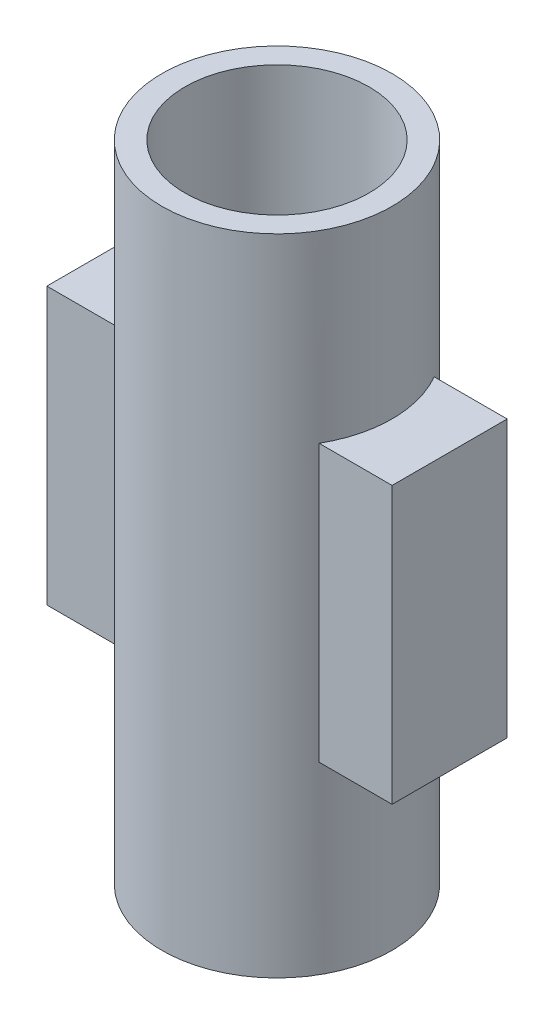
ISO-10303-21;
HEADER;
FILE_DESCRIPTION(('STEP AP214'),'2;1');
FILE_NAME('part.step','',(''),(''),'','','');
FILE_SCHEMA(('AUTOMOTIVE_DESIGN { 1 0 10303 214 1 1 1 1 }'));
ENDSEC;
DATA;
#1=APPLICATION_CONTEXT('core data for automotive mechanical design processes');
#2=APPLICATION_PROTOCOL_DEFINITION('international standard','automotive_design',2000,#1);
#3=PRODUCT_CONTEXT('',#1,'mechanical');
#4=PRODUCT('Part','Part','',(#3));
#5=PRODUCT_RELATED_PRODUCT_CATEGORY('part','',(#4));
#6=PRODUCT_DEFINITION_FORMATION('','',#4);
#7=PRODUCT_DEFINITION_CONTEXT('part definition',#1,'design');
#8=PRODUCT_DEFINITION('design','',#6,#7);
#9=PRODUCT_DEFINITION_SHAPE('','',#8);
#10=(LENGTH_UNIT() NAMED_UNIT(*) SI_UNIT(.MILLI.,.METRE.));
#11=(NAMED_UNIT(*) PLANE_ANGLE_UNIT() SI_UNIT($,.RADIAN.));
#12=(NAMED_UNIT(*) SI_UNIT($,.STERADIAN.) SOLID_ANGLE_UNIT());
#13=UNCERTAINTY_MEASURE_WITH_UNIT(LENGTH_MEASURE(1.E-05),#10,'distance_accuracy_value','');
#14=(GEOMETRIC_REPRESENTATION_CONTEXT(3) GLOBAL_UNCERTAINTY_ASSIGNED_CONTEXT((#13)) GLOBAL_UNIT_ASSIGNED_CONTEXT((#10,
#11,#12)) REPRESENTATION_CONTEXT('',''));
#15=CARTESIAN_POINT('',(0.,0.,0.));
#16=DIRECTION('',(0.,0.,1.));
#17=DIRECTION('',(1.,0.,0.));
#18=AXIS2_PLACEMENT_3D('',#15,#16,#17);
#19=CARTESIAN_POINT('',(0.,0.,0.));
#20=DIRECTION('',(0.,1.,0.));
#21=DIRECTION('',(0.,0.,1.));
#22=AXIS2_PLACEMENT_3D('',#19,#20,#21);
#23=PLANE('',#22);
#24=CARTESIAN_POINT('',(0.,0.,0.));
#25=DIRECTION('',(0.,-1.,0.));
#26=DIRECTION('',(0.,0.,-1.));
#27=AXIS2_PLACEMENT_3D('',#24,#25,#26);
#28=CIRCLE('',#27,5.);
#29=CARTESIAN_POINT('',(4.33012701892219,0.,-2.5));
#30=VERTEX_POINT('',#29);
#31=CARTESIAN_POINT('',(4.33012701892219,0.,2.5));
#32=VERTEX_POINT('',#31);
#33=EDGE_CURVE('E50',#30,#32,#28,.T.);
#34=ORIENTED_EDGE('',*,*,#33,.F.);
#35=DIRECTION('',(1.,0.,0.));
#36=VECTOR('',#35,1.);
#37=CARTESIAN_POINT('',(0.,0.,-2.5));
#38=LINE('',#37,#36);
#39=CARTESIAN_POINT('',(7.5,0.,-2.5));
#40=VERTEX_POINT('',#39);
#41=EDGE_CURVE('E137',#30,#40,#38,.T.);
#42=ORIENTED_EDGE('',*,*,#41,.T.);
#43=DIRECTION('',(0.,0.,1.));
#44=VECTOR('',#43,1.);
#45=CARTESIAN_POINT('',(7.5,0.,0.));
#46=LINE('',#45,#44);
#47=CARTESIAN_POINT('',(7.5,0.,2.5));
#48=VERTEX_POINT('',#47);
#49=EDGE_CURVE('E134',#40,#48,#46,.T.);
#50=ORIENTED_EDGE('',*,*,#49,.T.);
#51=DIRECTION('',(1.,0.,0.));
#52=VECTOR('',#51,1.);
#53=CARTESIAN_POINT('',(0.,0.,2.5));
#54=LINE('',#53,#52);
#55=EDGE_CURVE('E130',#32,#48,#54,.T.);
#56=ORIENTED_EDGE('',*,*,#55,.F.);
#57=EDGE_LOOP('',(#34,#42,#50,#56));
#58=FACE_BOUND('',#57,.T.);
#59=ADVANCED_FACE('F38',(#58),#23,.F.);
#60=CARTESIAN_POINT('',(-4.33012701892219,0.,2.5));
#61=VERTEX_POINT('',#60);
#62=CARTESIAN_POINT('',(-4.33012701892219,0.,-2.5));
#63=VERTEX_POINT('',#62);
#64=EDGE_CURVE('E11',#61,#63,#28,.T.);
#65=ORIENTED_EDGE('',*,*,#64,.F.);
#66=DIRECTION('',(1.,0.,0.));
#67=VECTOR('',#66,1.);
#68=CARTESIAN_POINT('',(0.,0.,2.5));
#69=LINE('',#68,#67);
#70=CARTESIAN_POINT('',(-7.5,0.,2.5));
#71=VERTEX_POINT('',#70);
#72=EDGE_CURVE('E127',#71,#61,#69,.T.);
#73=ORIENTED_EDGE('',*,*,#72,.F.);
#74=DIRECTION('',(0.,0.,1.));
#75=VECTOR('',#74,1.);
#76=CARTESIAN_POINT('',(-7.5,0.,0.));
#77=LINE('',#76,#75);
#78=CARTESIAN_POINT('',(-7.5,0.,-2.5));
#79=VERTEX_POINT('',#78);
#80=EDGE_CURVE('E80',#79,#71,#77,.T.);
#81=ORIENTED_EDGE('',*,*,#80,.F.);
#82=DIRECTION('',(1.,0.,0.));
#83=VECTOR('',#82,1.);
#84=CARTESIAN_POINT('',(0.,0.,-2.5));
#85=LINE('',#84,#83);
#86=EDGE_CURVE('E140',#79,#63,#85,.T.);
#87=ORIENTED_EDGE('',*,*,#86,.T.);
#88=EDGE_LOOP('',(#65,#73,#81,#87));
#89=FACE_BOUND('',#88,.T.);
#90=ADVANCED_FACE('F161',(#89),#23,.F.);
#91=CARTESIAN_POINT('',(0.,12.,0.));
#92=DIRECTION('',(0.,1.,0.));
#93=DIRECTION('',(0.,0.,1.));
#94=AXIS2_PLACEMENT_3D('',#91,#92,#93);
#95=PLANE('',#94);
#96=CARTESIAN_POINT('',(0.,12.,0.));
#97=DIRECTION('',(0.,1.,0.));
#98=DIRECTION('',(0.,0.,1.));
#99=AXIS2_PLACEMENT_3D('',#96,#97,#98);
#100=CIRCLE('',#99,5.);
#101=CARTESIAN_POINT('',(4.33012701892219,12.,2.5));
#102=VERTEX_POINT('',#101);
#103=CARTESIAN_POINT('',(4.33012701892219,12.,-2.5));
#104=VERTEX_POINT('',#103);
#105=EDGE_CURVE('E106',#102,#104,#100,.T.);
#106=ORIENTED_EDGE('',*,*,#105,.F.);
#107=DIRECTION('',(1.,0.,0.));
#108=VECTOR('',#107,1.);
#109=CARTESIAN_POINT('',(0.,12.,2.5));
#110=LINE('',#109,#108);
#111=CARTESIAN_POINT('',(7.5,12.,2.5));
#112=VERTEX_POINT('',#111);
#113=EDGE_CURVE('E201',#102,#112,#110,.T.);
#114=ORIENTED_EDGE('',*,*,#113,.T.);
#115=DIRECTION('',(0.,0.,1.));
#116=VECTOR('',#115,1.);
#117=CARTESIAN_POINT('',(7.5,12.,0.));
#118=LINE('',#117,#116);
#119=CARTESIAN_POINT('',(7.5,12.,-2.5));
#120=VERTEX_POINT('',#119);
#121=EDGE_CURVE('E123',#120,#112,#118,.T.);
#122=ORIENTED_EDGE('',*,*,#121,.F.);
#123=DIRECTION('',(1.,0.,0.));
#124=VECTOR('',#123,1.);
#125=CARTESIAN_POINT('',(0.,12.,-2.5));
#126=LINE('',#125,#124);
#127=EDGE_CURVE('E118',#104,#120,#126,.T.);
#128=ORIENTED_EDGE('',*,*,#127,.F.);
#129=EDGE_LOOP('',(#106,#114,#122,#128));
#130=FACE_BOUND('',#129,.T.);
#131=ADVANCED_FACE('F163',(#130),#95,.T.);
#132=CARTESIAN_POINT('',(0.,12.,2.5));
#133=DIRECTION('',(0.,0.,-1.));
#134=DIRECTION('',(-1.,0.,0.));
#135=AXIS2_PLACEMENT_3D('',#132,#133,#134);
#136=PLANE('',#135);
#137=ORIENTED_EDGE('',*,*,#72,.T.);
#138=DIRECTION('',(0.,-1.,0.));
#139=VECTOR('',#138,1.);
#140=CARTESIAN_POINT('',(-4.33012701892219,12.,2.5));
#141=LINE('',#140,#139);
#142=CARTESIAN_POINT('',(-4.33012701892219,12.,2.5));
#143=VERTEX_POINT('',#142);
#144=EDGE_CURVE('E42',#143,#61,#141,.T.);
#145=ORIENTED_EDGE('',*,*,#144,.F.);
#146=DIRECTION('',(1.,0.,0.));
#147=VECTOR('',#146,1.);
#148=CARTESIAN_POINT('',(0.,12.,2.5));
#149=LINE('',#148,#147);
#150=CARTESIAN_POINT('',(-7.5,12.,2.5));
#151=VERTEX_POINT('',#150);
#152=EDGE_CURVE('E86',#151,#143,#149,.T.);
#153=ORIENTED_EDGE('',*,*,#152,.F.);
#154=DIRECTION('',(0.,-1.,0.));
#155=VECTOR('',#154,1.);
#156=CARTESIAN_POINT('',(-7.5,12.,2.5));
#157=LINE('',#156,#155);
#158=EDGE_CURVE('E120',#151,#71,#157,.T.);
#159=ORIENTED_EDGE('',*,*,#158,.T.);
#160=EDGE_LOOP('',(#137,#145,#153,#159));
#161=FACE_BOUND('',#160,.T.);
#162=ADVANCED_FACE('F40',(#161),#136,.F.);
#163=CARTESIAN_POINT('',(0.,12.,2.5));
#164=DIRECTION('',(0.,0.,-1.));
#165=DIRECTION('',(-1.,0.,0.));
#166=AXIS2_PLACEMENT_3D('',#163,#164,#165);
#167=PLANE('',#166);
#168=ORIENTED_EDGE('',*,*,#55,.T.);
#169=DIRECTION('',(0.,-1.,0.));
#170=VECTOR('',#169,1.);
#171=CARTESIAN_POINT('',(7.5,12.,2.5));
#172=LINE('',#171,#170);
#173=EDGE_CURVE('E149',#112,#48,#172,.T.);
#174=ORIENTED_EDGE('',*,*,#173,.F.);
#175=ORIENTED_EDGE('',*,*,#113,.F.);
#176=DIRECTION('',(0.,-1.,0.));
#177=VECTOR('',#176,1.);
#178=CARTESIAN_POINT('',(4.33012701892219,12.,2.5));
#179=LINE('',#178,#177);
#180=EDGE_CURVE('E150',#102,#32,#179,.T.);
#181=ORIENTED_EDGE('',*,*,#180,.T.);
#182=EDGE_LOOP('',(#168,#174,#175,#181));
#183=FACE_BOUND('',#182,.T.);
#184=ADVANCED_FACE('F188',(#183),#167,.F.);
#185=CARTESIAN_POINT('',(7.5,12.,0.));
#186=DIRECTION('',(1.,0.,0.));
#187=DIRECTION('',(0.,0.,-1.));
#188=AXIS2_PLACEMENT_3D('',#185,#186,#187);
#189=PLANE('',#188);
#190=ORIENTED_EDGE('',*,*,#49,.F.);
#191=DIRECTION('',(0.,-1.,0.));
#192=VECTOR('',#191,1.);
#193=CARTESIAN_POINT('',(7.5,12.,-2.5));
#194=LINE('',#193,#192);
#195=EDGE_CURVE('E147',#120,#40,#194,.T.);
#196=ORIENTED_EDGE('',*,*,#195,.F.);
#197=ORIENTED_EDGE('',*,*,#121,.T.);
#198=ORIENTED_EDGE('',*,*,#173,.T.);
#199=EDGE_LOOP('',(#190,#196,#197,#198));
#200=FACE_BOUND('',#199,.T.);
#201=ADVANCED_FACE('F185',(#200),#189,.T.);
#202=CARTESIAN_POINT('',(0.,12.,-2.5));
#203=DIRECTION('',(0.,0.,-1.));
#204=DIRECTION('',(-1.,0.,0.));
#205=AXIS2_PLACEMENT_3D('',#202,#203,#204);
#206=PLANE('',#205);
#207=ORIENTED_EDGE('',*,*,#41,.F.);
#208=DIRECTION('',(0.,-1.,0.));
#209=VECTOR('',#208,1.);
#210=CARTESIAN_POINT('',(4.33012701892219,12.,-2.5));
#211=LINE('',#210,#209);
#212=EDGE_CURVE('E115',#104,#30,#211,.T.);
#213=ORIENTED_EDGE('',*,*,#212,.F.);
#214=ORIENTED_EDGE('',*,*,#127,.T.);
#215=ORIENTED_EDGE('',*,*,#195,.T.);
#216=EDGE_LOOP('',(#207,#213,#214,#215));
#217=FACE_BOUND('',#216,.T.);
#218=ADVANCED_FACE('F181',(#217),#206,.T.);
#219=CARTESIAN_POINT('',(0.,12.,0.));
#220=DIRECTION('',(0.,-1.,0.));
#221=DIRECTION('',(0.,0.,-1.));
#222=AXIS2_PLACEMENT_3D('',#219,#220,#221);
#223=CYLINDRICAL_SURFACE('',#222,5.);
#224=ORIENTED_EDGE('',*,*,#33,.T.);
#225=ORIENTED_EDGE('',*,*,#180,.F.);
#226=ORIENTED_EDGE('',*,*,#105,.T.);
#227=ORIENTED_EDGE('',*,*,#212,.T.);
#228=EDGE_LOOP('',(#224,#225,#226,#227));
#229=FACE_BOUND('',#228,.T.);
#230=ORIENTED_EDGE('',*,*,#144,.T.);
#231=ORIENTED_EDGE('',*,*,#64,.T.);
#232=DIRECTION('',(0.,-1.,0.));
#233=VECTOR('',#232,1.);
#234=CARTESIAN_POINT('',(-4.33012701892219,12.,-2.5));
#235=LINE('',#234,#233);
#236=CARTESIAN_POINT('',(-4.33012701892219,12.,-2.5));
#237=VERTEX_POINT('',#236);
#238=EDGE_CURVE('E108',#237,#63,#235,.T.);
#239=ORIENTED_EDGE('',*,*,#238,.F.);
#240=EDGE_CURVE('E48',#237,#143,#100,.T.);
#241=ORIENTED_EDGE('',*,*,#240,.T.);
#242=EDGE_LOOP('',(#230,#231,#239,#241));
#243=FACE_BOUND('',#242,.T.);
#244=CARTESIAN_POINT('',(0.,20.,0.));
#245=DIRECTION('',(0.,1.,0.));
#246=DIRECTION('',(0.,0.,1.));
#247=AXIS2_PLACEMENT_3D('',#244,#245,#246);
#248=CIRCLE('',#247,5.);
#249=CARTESIAN_POINT('',(0.,20.,5.));
#250=VERTEX_POINT('',#249);
#251=EDGE_CURVE('E131',#250,#250,#248,.T.);
#252=ORIENTED_EDGE('',*,*,#251,.F.);
#253=EDGE_LOOP('',(#252));
#254=FACE_BOUND('',#253,.T.);
#255=CARTESIAN_POINT('',(0.,-8.,0.));
#256=DIRECTION('',(0.,-1.,0.));
#257=DIRECTION('',(0.,0.,-1.));
#258=AXIS2_PLACEMENT_3D('',#255,#256,#257);
#259=CIRCLE('',#258,5.);
#260=CARTESIAN_POINT('',(0.,-8.,-5.));
#261=VERTEX_POINT('',#260);
#262=EDGE_CURVE('E206',#261,#261,#259,.T.);
#263=ORIENTED_EDGE('',*,*,#262,.F.);
#264=EDGE_LOOP('',(#263));
#265=FACE_BOUND('',#264,.T.);
#266=ADVANCED_FACE('F109',(#229,#243,#254,#265),#223,.T.);
#267=CARTESIAN_POINT('',(0.,12.,-2.5));
#268=DIRECTION('',(0.,0.,-1.));
#269=DIRECTION('',(-1.,0.,0.));
#270=AXIS2_PLACEMENT_3D('',#267,#268,#269);
#271=PLANE('',#270);
#272=ORIENTED_EDGE('',*,*,#86,.F.);
#273=DIRECTION('',(0.,-1.,0.));
#274=VECTOR('',#273,1.);
#275=CARTESIAN_POINT('',(-7.5,12.,-2.5));
#276=LINE('',#275,#274);
#277=CARTESIAN_POINT('',(-7.5,12.,-2.5));
#278=VERTEX_POINT('',#277);
#279=EDGE_CURVE('E77',#278,#79,#276,.T.);
#280=ORIENTED_EDGE('',*,*,#279,.F.);
#281=DIRECTION('',(1.,0.,0.));
#282=VECTOR('',#281,1.);
#283=CARTESIAN_POINT('',(0.,12.,-2.5));
#284=LINE('',#283,#282);
#285=EDGE_CURVE('E102',#278,#237,#284,.T.);
#286=ORIENTED_EDGE('',*,*,#285,.T.);
#287=ORIENTED_EDGE('',*,*,#238,.T.);
#288=EDGE_LOOP('',(#272,#280,#286,#287));
#289=FACE_BOUND('',#288,.T.);
#290=ADVANCED_FACE('F117',(#289),#271,.T.);
#291=CARTESIAN_POINT('',(-7.5,12.,0.));
#292=DIRECTION('',(1.,0.,0.));
#293=DIRECTION('',(0.,0.,-1.));
#294=AXIS2_PLACEMENT_3D('',#291,#292,#293);
#295=PLANE('',#294);
#296=ORIENTED_EDGE('',*,*,#80,.T.);
#297=ORIENTED_EDGE('',*,*,#158,.F.);
#298=DIRECTION('',(0.,0.,1.));
#299=VECTOR('',#298,1.);
#300=CARTESIAN_POINT('',(-7.5,12.,0.));
#301=LINE('',#300,#299);
#302=EDGE_CURVE('E58',#278,#151,#301,.T.);
#303=ORIENTED_EDGE('',*,*,#302,.F.);
#304=ORIENTED_EDGE('',*,*,#279,.T.);
#305=EDGE_LOOP('',(#296,#297,#303,#304));
#306=FACE_BOUND('',#305,.T.);
#307=ADVANCED_FACE('F174',(#306),#295,.F.);
#308=ORIENTED_EDGE('',*,*,#240,.F.);
#309=ORIENTED_EDGE('',*,*,#285,.F.);
#310=ORIENTED_EDGE('',*,*,#302,.T.);
#311=ORIENTED_EDGE('',*,*,#152,.T.);
#312=EDGE_LOOP('',(#308,#309,#310,#311));
#313=FACE_BOUND('',#312,.T.);
#314=ADVANCED_FACE('F100',(#313),#95,.T.);
#315=CARTESIAN_POINT('',(0.,20.,0.));
#316=DIRECTION('',(0.,1.,0.));
#317=DIRECTION('',(0.,0.,1.));
#318=AXIS2_PLACEMENT_3D('',#315,#316,#317);
#319=PLANE('',#318);
#320=CARTESIAN_POINT('',(0.,20.,0.));
#321=DIRECTION('',(0.,-1.,0.));
#322=DIRECTION('',(0.,0.,-1.));
#323=AXIS2_PLACEMENT_3D('',#320,#321,#322);
#324=CIRCLE('',#323,4.);
#325=CARTESIAN_POINT('',(0.,20.,-4.));
#326=VERTEX_POINT('',#325);
#327=EDGE_CURVE('E210',#326,#326,#324,.T.);
#328=ORIENTED_EDGE('',*,*,#327,.T.);
#329=EDGE_LOOP('',(#328));
#330=FACE_BOUND('',#329,.T.);
#331=ORIENTED_EDGE('',*,*,#251,.T.);
#332=EDGE_LOOP('',(#331));
#333=FACE_BOUND('',#332,.T.);
#334=ADVANCED_FACE('F219',(#330,#333),#319,.T.);
#335=CARTESIAN_POINT('',(0.,-8.,0.));
#336=DIRECTION('',(0.,-1.,0.));
#337=DIRECTION('',(0.,0.,-1.));
#338=AXIS2_PLACEMENT_3D('',#335,#336,#337);
#339=PLANE('',#338);
#340=CARTESIAN_POINT('',(0.,-8.,0.));
#341=DIRECTION('',(0.,-1.,0.));
#342=DIRECTION('',(0.,0.,-1.));
#343=AXIS2_PLACEMENT_3D('',#340,#341,#342);
#344=CIRCLE('',#343,4.);
#345=CARTESIAN_POINT('',(0.,-8.,-4.));
#346=VERTEX_POINT('',#345);
#347=EDGE_CURVE('E213',#346,#346,#344,.T.);
#348=ORIENTED_EDGE('',*,*,#347,.F.);
#349=EDGE_LOOP('',(#348));
#350=FACE_BOUND('',#349,.T.);
#351=ORIENTED_EDGE('',*,*,#262,.T.);
#352=EDGE_LOOP('',(#351));
#353=FACE_BOUND('',#352,.T.);
#354=ADVANCED_FACE('F225',(#350,#353),#339,.T.);
#355=CARTESIAN_POINT('',(0.,20.,0.));
#356=DIRECTION('',(0.,-1.,0.));
#357=DIRECTION('',(0.,0.,-1.));
#358=AXIS2_PLACEMENT_3D('',#355,#356,#357);
#359=CYLINDRICAL_SURFACE('',#358,4.);
#360=ORIENTED_EDGE('',*,*,#327,.F.);
#361=EDGE_LOOP('',(#360));
#362=FACE_BOUND('',#361,.T.);
#363=ORIENTED_EDGE('',*,*,#347,.T.);
#364=EDGE_LOOP('',(#363));
#365=FACE_BOUND('',#364,.T.);
#366=ADVANCED_FACE('F222',(#362,#365),#359,.F.);
#367=CLOSED_SHELL('',(#59,#90,#131,#162,#184,#201,#218,#266,#290,#307,#314,#334,#354,#366));
#368=MANIFOLD_SOLID_BREP('B2',#367);
#369=ADVANCED_BREP_SHAPE_REPRESENTATION('',(#18,#368),#14);
#370=SHAPE_DEFINITION_REPRESENTATION(#9,#369);
ENDSEC;
END-ISO-10303-21;
